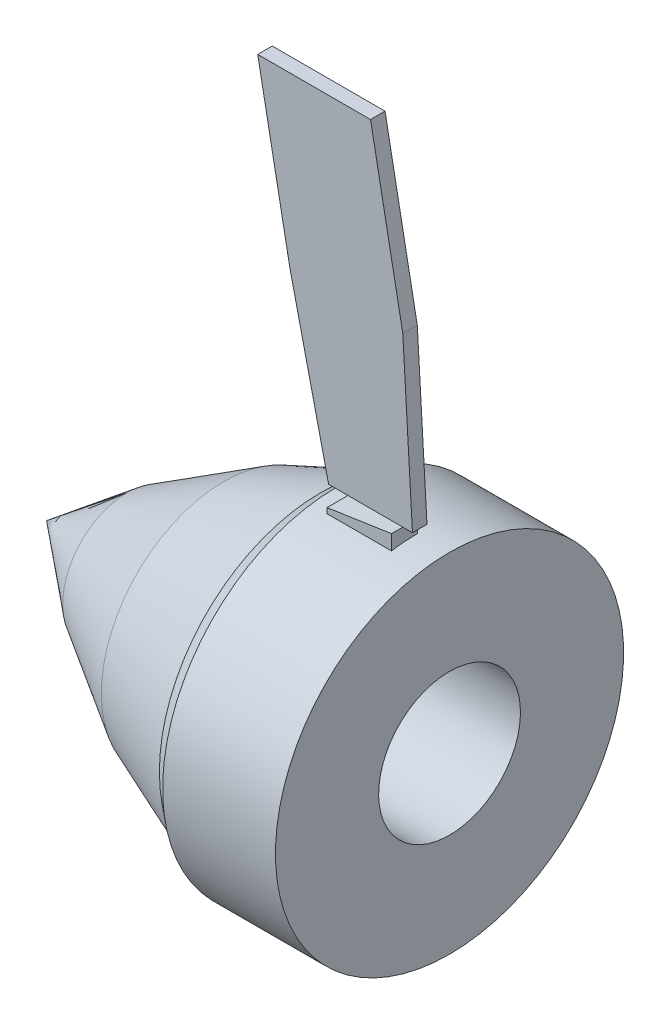
ISO-10303-21;
HEADER;
FILE_DESCRIPTION(('STEP AP214'),'2;1');
FILE_NAME('part.step','',(''),(''),'','','');
FILE_SCHEMA(('AUTOMOTIVE_DESIGN { 1 0 10303 214 1 1 1 1 }'));
ENDSEC;
DATA;
#1=APPLICATION_CONTEXT('core data for automotive mechanical design processes');
#2=APPLICATION_PROTOCOL_DEFINITION('international standard','automotive_design',2000,#1);
#3=PRODUCT_CONTEXT('',#1,'mechanical');
#4=PRODUCT('Part','Part','',(#3));
#5=PRODUCT_RELATED_PRODUCT_CATEGORY('part','',(#4));
#6=PRODUCT_DEFINITION_FORMATION('','',#4);
#7=PRODUCT_DEFINITION_CONTEXT('part definition',#1,'design');
#8=PRODUCT_DEFINITION('design','',#6,#7);
#9=PRODUCT_DEFINITION_SHAPE('','',#8);
#10=(LENGTH_UNIT() NAMED_UNIT(*) SI_UNIT(.MILLI.,.METRE.));
#11=(NAMED_UNIT(*) PLANE_ANGLE_UNIT() SI_UNIT($,.RADIAN.));
#12=(NAMED_UNIT(*) SI_UNIT($,.STERADIAN.) SOLID_ANGLE_UNIT());
#13=UNCERTAINTY_MEASURE_WITH_UNIT(LENGTH_MEASURE(1.E-05),#10,'distance_accuracy_value','');
#14=(GEOMETRIC_REPRESENTATION_CONTEXT(3) GLOBAL_UNCERTAINTY_ASSIGNED_CONTEXT((#13)) GLOBAL_UNIT_ASSIGNED_CONTEXT((#10,
#11,#12)) REPRESENTATION_CONTEXT('',''));
#15=CARTESIAN_POINT('',(0.,0.,0.));
#16=DIRECTION('',(0.,0.,1.));
#17=DIRECTION('',(1.,0.,0.));
#18=AXIS2_PLACEMENT_3D('',#15,#16,#17);
#19=CARTESIAN_POINT('',(1180.,580.,45.));
#20=DIRECTION('',(0.,1.,0.));
#21=DIRECTION('',(0.,0.,1.));
#22=AXIS2_PLACEMENT_3D('',#19,#20,#21);
#23=PLANE('',#22);
#24=DIRECTION('',(1.,0.,0.));
#25=VECTOR('',#24,1.);
#26=CARTESIAN_POINT('',(1180.,580.,0.));
#27=LINE('',#26,#25);
#28=CARTESIAN_POINT('',(920.,580.,0.));
#29=VERTEX_POINT('',#28);
#30=CARTESIAN_POINT('',(1180.,580.,0.));
#31=VERTEX_POINT('',#30);
#32=EDGE_CURVE('E131',#29,#31,#27,.T.);
#33=ORIENTED_EDGE('',*,*,#32,.T.);
#34=DIRECTION('',(0.,0.,-1.));
#35=VECTOR('',#34,1.);
#36=CARTESIAN_POINT('',(1180.,580.,45.));
#37=LINE('',#36,#35);
#38=CARTESIAN_POINT('',(1180.,580.,45.));
#39=VERTEX_POINT('',#38);
#40=EDGE_CURVE('E12',#39,#31,#37,.T.);
#41=ORIENTED_EDGE('',*,*,#40,.F.);
#42=DIRECTION('',(1.,0.,0.));
#43=VECTOR('',#42,1.);
#44=CARTESIAN_POINT('',(1180.,580.,45.));
#45=LINE('',#44,#43);
#46=CARTESIAN_POINT('',(920.,580.,45.));
#47=VERTEX_POINT('',#46);
#48=EDGE_CURVE('E145',#47,#39,#45,.T.);
#49=ORIENTED_EDGE('',*,*,#48,.F.);
#50=DIRECTION('',(0.,0.,-1.));
#51=VECTOR('',#50,1.);
#52=CARTESIAN_POINT('',(920.,580.,45.));
#53=LINE('',#52,#51);
#54=EDGE_CURVE('E128',#47,#29,#53,.T.);
#55=ORIENTED_EDGE('',*,*,#54,.T.);
#56=EDGE_LOOP('',(#33,#41,#49,#55));
#57=FACE_BOUND('',#56,.T.);
#58=ADVANCED_FACE('F49',(#57),#23,.F.);
#59=CARTESIAN_POINT('',(1150.,1100.,45.));
#60=DIRECTION('',(-0.998339941675609,-0.0575965350966698,0.));
#61=DIRECTION('',(0.0575965350966698,-0.998339941675609,0.));
#62=AXIS2_PLACEMENT_3D('',#59,#60,#61);
#63=PLANE('',#62);
#64=DIRECTION('',(-0.0575965350966698,0.998339941675609,0.));
#65=VECTOR('',#64,1.);
#66=CARTESIAN_POINT('',(1150.,1100.,0.));
#67=LINE('',#66,#65);
#68=CARTESIAN_POINT('',(1150.,1100.,0.));
#69=VERTEX_POINT('',#68);
#70=EDGE_CURVE('E140',#31,#69,#67,.T.);
#71=ORIENTED_EDGE('',*,*,#70,.T.);
#72=DIRECTION('',(0.,0.,-1.));
#73=VECTOR('',#72,1.);
#74=CARTESIAN_POINT('',(1150.,1100.,45.));
#75=LINE('',#74,#73);
#76=CARTESIAN_POINT('',(1150.,1100.,45.));
#77=VERTEX_POINT('',#76);
#78=EDGE_CURVE('E59',#77,#69,#75,.T.);
#79=ORIENTED_EDGE('',*,*,#78,.F.);
#80=DIRECTION('',(-0.0575965350966698,0.998339941675609,0.));
#81=VECTOR('',#80,1.);
#82=CARTESIAN_POINT('',(1150.,1100.,45.));
#83=LINE('',#82,#81);
#84=EDGE_CURVE('E103',#39,#77,#83,.T.);
#85=ORIENTED_EDGE('',*,*,#84,.F.);
#86=ORIENTED_EDGE('',*,*,#40,.T.);
#87=EDGE_LOOP('',(#71,#79,#85,#86));
#88=FACE_BOUND('',#87,.T.);
#89=ADVANCED_FACE('F169',(#88),#63,.F.);
#90=CARTESIAN_POINT('',(1050.,1625.,45.));
#91=DIRECTION('',(-0.982338566422475,-0.187112107889995,0.));
#92=DIRECTION('',(0.187112107889995,-0.982338566422475,0.));
#93=AXIS2_PLACEMENT_3D('',#90,#91,#92);
#94=PLANE('',#93);
#95=DIRECTION('',(-0.187112107889995,0.982338566422475,0.));
#96=VECTOR('',#95,1.);
#97=CARTESIAN_POINT('',(1050.,1625.,0.));
#98=LINE('',#97,#96);
#99=CARTESIAN_POINT('',(1050.,1625.,0.));
#100=VERTEX_POINT('',#99);
#101=EDGE_CURVE('E136',#69,#100,#98,.T.);
#102=ORIENTED_EDGE('',*,*,#101,.T.);
#103=DIRECTION('',(0.,0.,-1.));
#104=VECTOR('',#103,1.);
#105=CARTESIAN_POINT('',(1050.,1625.,45.));
#106=LINE('',#105,#104);
#107=CARTESIAN_POINT('',(1050.,1625.,45.));
#108=VERTEX_POINT('',#107);
#109=EDGE_CURVE('E123',#108,#100,#106,.T.);
#110=ORIENTED_EDGE('',*,*,#109,.F.);
#111=DIRECTION('',(-0.187112107889995,0.982338566422475,0.));
#112=VECTOR('',#111,1.);
#113=CARTESIAN_POINT('',(1050.,1625.,45.));
#114=LINE('',#113,#112);
#115=EDGE_CURVE('E117',#77,#108,#114,.T.);
#116=ORIENTED_EDGE('',*,*,#115,.F.);
#117=ORIENTED_EDGE('',*,*,#78,.T.);
#118=EDGE_LOOP('',(#102,#110,#116,#117));
#119=FACE_BOUND('',#118,.T.);
#120=ADVANCED_FACE('F147',(#119),#94,.F.);
#121=CARTESIAN_POINT('',(700.,1625.,45.));
#122=DIRECTION('',(0.,-1.,0.));
#123=DIRECTION('',(0.,0.,-1.));
#124=AXIS2_PLACEMENT_3D('',#121,#122,#123);
#125=PLANE('',#124);
#126=DIRECTION('',(-1.,0.,0.));
#127=VECTOR('',#126,1.);
#128=CARTESIAN_POINT('',(700.,1625.,0.));
#129=LINE('',#128,#127);
#130=CARTESIAN_POINT('',(700.,1625.,0.));
#131=VERTEX_POINT('',#130);
#132=EDGE_CURVE('E121',#100,#131,#129,.T.);
#133=ORIENTED_EDGE('',*,*,#132,.T.);
#134=DIRECTION('',(0.,0.,-1.));
#135=VECTOR('',#134,1.);
#136=CARTESIAN_POINT('',(700.,1625.,45.));
#137=LINE('',#136,#135);
#138=CARTESIAN_POINT('',(700.,1625.,45.));
#139=VERTEX_POINT('',#138);
#140=EDGE_CURVE('E122',#139,#131,#137,.T.);
#141=ORIENTED_EDGE('',*,*,#140,.F.);
#142=DIRECTION('',(-1.,0.,0.));
#143=VECTOR('',#142,1.);
#144=CARTESIAN_POINT('',(700.,1625.,45.));
#145=LINE('',#144,#143);
#146=EDGE_CURVE('E109',#108,#139,#145,.T.);
#147=ORIENTED_EDGE('',*,*,#146,.F.);
#148=ORIENTED_EDGE('',*,*,#109,.T.);
#149=EDGE_LOOP('',(#133,#141,#147,#148));
#150=FACE_BOUND('',#149,.T.);
#151=ADVANCED_FACE('F125',(#150),#125,.F.);
#152=CARTESIAN_POINT('',(800.,1100.,45.));
#153=DIRECTION('',(0.982338566422475,0.187112107889995,0.));
#154=DIRECTION('',(-0.187112107889995,0.982338566422475,0.));
#155=AXIS2_PLACEMENT_3D('',#152,#153,#154);
#156=PLANE('',#155);
#157=DIRECTION('',(0.187112107889995,-0.982338566422475,0.));
#158=VECTOR('',#157,1.);
#159=CARTESIAN_POINT('',(800.,1100.,0.));
#160=LINE('',#159,#158);
#161=CARTESIAN_POINT('',(800.,1100.,0.));
#162=VERTEX_POINT('',#161);
#163=EDGE_CURVE('E90',#131,#162,#160,.T.);
#164=ORIENTED_EDGE('',*,*,#163,.T.);
#165=DIRECTION('',(0.,0.,-1.));
#166=VECTOR('',#165,1.);
#167=CARTESIAN_POINT('',(800.,1100.,45.));
#168=LINE('',#167,#166);
#169=CARTESIAN_POINT('',(800.,1100.,45.));
#170=VERTEX_POINT('',#169);
#171=EDGE_CURVE('E127',#170,#162,#168,.T.);
#172=ORIENTED_EDGE('',*,*,#171,.F.);
#173=DIRECTION('',(0.187112107889995,-0.982338566422475,0.));
#174=VECTOR('',#173,1.);
#175=CARTESIAN_POINT('',(800.,1100.,45.));
#176=LINE('',#175,#174);
#177=EDGE_CURVE('E111',#139,#170,#176,.T.);
#178=ORIENTED_EDGE('',*,*,#177,.F.);
#179=ORIENTED_EDGE('',*,*,#140,.T.);
#180=EDGE_LOOP('',(#164,#172,#178,#179));
#181=FACE_BOUND('',#180,.T.);
#182=ADVANCED_FACE('F126',(#181),#156,.F.);
#183=CARTESIAN_POINT('',(920.,580.,45.));
#184=DIRECTION('',(0.97439119569462,0.224859506698758,0.));
#185=DIRECTION('',(-0.224859506698758,0.97439119569462,0.));
#186=AXIS2_PLACEMENT_3D('',#183,#184,#185);
#187=PLANE('',#186);
#188=DIRECTION('',(0.224859506698758,-0.97439119569462,0.));
#189=VECTOR('',#188,1.);
#190=CARTESIAN_POINT('',(920.,580.,0.));
#191=LINE('',#190,#189);
#192=EDGE_CURVE('E92',#162,#29,#191,.T.);
#193=ORIENTED_EDGE('',*,*,#192,.T.);
#194=ORIENTED_EDGE('',*,*,#54,.F.);
#195=DIRECTION('',(0.224859506698758,-0.97439119569462,0.));
#196=VECTOR('',#195,1.);
#197=CARTESIAN_POINT('',(920.,580.,45.));
#198=LINE('',#197,#196);
#199=EDGE_CURVE('E67',#170,#47,#198,.T.);
#200=ORIENTED_EDGE('',*,*,#199,.F.);
#201=ORIENTED_EDGE('',*,*,#171,.T.);
#202=EDGE_LOOP('',(#193,#194,#200,#201));
#203=FACE_BOUND('',#202,.T.);
#204=ADVANCED_FACE('F160',(#203),#187,.F.);
#205=CARTESIAN_POINT('',(0.,0.,45.));
#206=DIRECTION('',(0.,0.,1.));
#207=DIRECTION('',(1.,0.,0.));
#208=AXIS2_PLACEMENT_3D('',#205,#206,#207);
#209=PLANE('',#208);
#210=ORIENTED_EDGE('',*,*,#48,.T.);
#211=ORIENTED_EDGE('',*,*,#84,.T.);
#212=ORIENTED_EDGE('',*,*,#115,.T.);
#213=ORIENTED_EDGE('',*,*,#146,.T.);
#214=ORIENTED_EDGE('',*,*,#177,.T.);
#215=ORIENTED_EDGE('',*,*,#199,.T.);
#216=EDGE_LOOP('',(#210,#211,#212,#213,#214,#215));
#217=FACE_BOUND('',#216,.T.);
#218=ADVANCED_FACE('F115',(#217),#209,.T.);
#219=CARTESIAN_POINT('',(0.,0.,0.));
#220=DIRECTION('',(0.,0.,1.));
#221=DIRECTION('',(1.,0.,0.));
#222=AXIS2_PLACEMENT_3D('',#219,#220,#221);
#223=PLANE('',#222);
#224=ORIENTED_EDGE('',*,*,#32,.F.);
#225=ORIENTED_EDGE('',*,*,#192,.F.);
#226=ORIENTED_EDGE('',*,*,#163,.F.);
#227=ORIENTED_EDGE('',*,*,#132,.F.);
#228=ORIENTED_EDGE('',*,*,#101,.F.);
#229=ORIENTED_EDGE('',*,*,#70,.F.);
#230=EDGE_LOOP('',(#224,#225,#226,#227,#228,#229));
#231=FACE_BOUND('',#230,.T.);
#232=ADVANCED_FACE('F153',(#231),#223,.F.);
#233=CLOSED_SHELL('',(#58,#89,#120,#151,#182,#204,#218,#232));
#234=MANIFOLD_SOLID_BREP('B2',#233);
#235=CARTESIAN_POINT('',(1150.,500.,80.));
#236=DIRECTION('',(0.,1.,0.));
#237=DIRECTION('',(0.,0.,1.));
#238=AXIS2_PLACEMENT_3D('',#235,#236,#237);
#239=PLANE('',#238);
#240=DIRECTION('',(1.,0.,0.));
#241=VECTOR('',#240,1.);
#242=CARTESIAN_POINT('',(1150.,500.,0.));
#243=LINE('',#242,#241);
#244=CARTESIAN_POINT('',(950.,500.,0.));
#245=VERTEX_POINT('',#244);
#246=CARTESIAN_POINT('',(1150.,500.,0.));
#247=VERTEX_POINT('',#246);
#248=EDGE_CURVE('E296',#245,#247,#243,.T.);
#249=ORIENTED_EDGE('',*,*,#248,.T.);
#250=DIRECTION('',(0.,0.,-1.));
#251=VECTOR('',#250,1.);
#252=CARTESIAN_POINT('',(1150.,500.,80.));
#253=LINE('',#252,#251);
#254=CARTESIAN_POINT('',(1150.,500.,80.));
#255=VERTEX_POINT('',#254);
#256=EDGE_CURVE('E48',#255,#247,#253,.T.);
#257=ORIENTED_EDGE('',*,*,#256,.F.);
#258=DIRECTION('',(1.,0.,0.));
#259=VECTOR('',#258,1.);
#260=CARTESIAN_POINT('',(1150.,500.,80.));
#261=LINE('',#260,#259);
#262=CARTESIAN_POINT('',(950.,500.,80.));
#263=VERTEX_POINT('',#262);
#264=EDGE_CURVE('E290',#263,#255,#261,.T.);
#265=ORIENTED_EDGE('',*,*,#264,.F.);
#266=DIRECTION('',(0.,0.,-1.));
#267=VECTOR('',#266,1.);
#268=CARTESIAN_POINT('',(950.,500.,80.));
#269=LINE('',#268,#267);
#270=EDGE_CURVE('E293',#263,#245,#269,.T.);
#271=ORIENTED_EDGE('',*,*,#270,.T.);
#272=EDGE_LOOP('',(#249,#257,#265,#271));
#273=FACE_BOUND('',#272,.T.);
#274=ADVANCED_FACE('F237',(#273),#239,.F.);
#275=CARTESIAN_POINT('',(1150.,580.,80.));
#276=DIRECTION('',(-1.,0.,0.));
#277=DIRECTION('',(0.,0.,1.));
#278=AXIS2_PLACEMENT_3D('',#275,#276,#277);
#279=PLANE('',#278);
#280=DIRECTION('',(0.,1.,0.));
#281=VECTOR('',#280,1.);
#282=CARTESIAN_POINT('',(1150.,580.,0.));
#283=LINE('',#282,#281);
#284=CARTESIAN_POINT('',(1150.,580.,0.));
#285=VERTEX_POINT('',#284);
#286=EDGE_CURVE('E292',#247,#285,#283,.T.);
#287=ORIENTED_EDGE('',*,*,#286,.T.);
#288=DIRECTION('',(0.,0.,-1.));
#289=VECTOR('',#288,1.);
#290=CARTESIAN_POINT('',(1150.,580.,80.));
#291=LINE('',#290,#289);
#292=CARTESIAN_POINT('',(1150.,580.,80.));
#293=VERTEX_POINT('',#292);
#294=EDGE_CURVE('E241',#293,#285,#291,.T.);
#295=ORIENTED_EDGE('',*,*,#294,.F.);
#296=DIRECTION('',(0.,1.,0.));
#297=VECTOR('',#296,1.);
#298=CARTESIAN_POINT('',(1150.,580.,80.));
#299=LINE('',#298,#297);
#300=EDGE_CURVE('E285',#255,#293,#299,.T.);
#301=ORIENTED_EDGE('',*,*,#300,.F.);
#302=ORIENTED_EDGE('',*,*,#256,.T.);
#303=EDGE_LOOP('',(#287,#295,#301,#302));
#304=FACE_BOUND('',#303,.T.);
#305=ADVANCED_FACE('F288',(#304),#279,.F.);
#306=CARTESIAN_POINT('',(950.,550.,80.));
#307=DIRECTION('',(0.148340452930244,-0.988936352868298,0.));
#308=DIRECTION('',(0.988936352868298,0.148340452930244,0.));
#309=AXIS2_PLACEMENT_3D('',#306,#307,#308);
#310=PLANE('',#309);
#311=DIRECTION('',(-0.988936352868298,-0.148340452930244,0.));
#312=VECTOR('',#311,1.);
#313=CARTESIAN_POINT('',(950.,550.,0.));
#314=LINE('',#313,#312);
#315=CARTESIAN_POINT('',(950.,550.,0.));
#316=VERTEX_POINT('',#315);
#317=EDGE_CURVE('E267',#285,#316,#314,.T.);
#318=ORIENTED_EDGE('',*,*,#317,.T.);
#319=DIRECTION('',(0.,0.,-1.));
#320=VECTOR('',#319,1.);
#321=CARTESIAN_POINT('',(950.,550.,80.));
#322=LINE('',#321,#320);
#323=CARTESIAN_POINT('',(950.,550.,80.));
#324=VERTEX_POINT('',#323);
#325=EDGE_CURVE('E295',#324,#316,#322,.T.);
#326=ORIENTED_EDGE('',*,*,#325,.F.);
#327=DIRECTION('',(-0.988936352868298,-0.148340452930244,0.));
#328=VECTOR('',#327,1.);
#329=CARTESIAN_POINT('',(950.,550.,80.));
#330=LINE('',#329,#328);
#331=EDGE_CURVE('E283',#293,#324,#330,.T.);
#332=ORIENTED_EDGE('',*,*,#331,.F.);
#333=ORIENTED_EDGE('',*,*,#294,.T.);
#334=EDGE_LOOP('',(#318,#326,#332,#333));
#335=FACE_BOUND('',#334,.T.);
#336=ADVANCED_FACE('F291',(#335),#310,.F.);
#337=CARTESIAN_POINT('',(950.,500.,80.));
#338=DIRECTION('',(1.,0.,0.));
#339=DIRECTION('',(0.,0.,-1.));
#340=AXIS2_PLACEMENT_3D('',#337,#338,#339);
#341=PLANE('',#340);
#342=DIRECTION('',(0.,-1.,0.));
#343=VECTOR('',#342,1.);
#344=CARTESIAN_POINT('',(950.,500.,0.));
#345=LINE('',#344,#343);
#346=EDGE_CURVE('E274',#316,#245,#345,.T.);
#347=ORIENTED_EDGE('',*,*,#346,.T.);
#348=ORIENTED_EDGE('',*,*,#270,.F.);
#349=DIRECTION('',(0.,-1.,0.));
#350=VECTOR('',#349,1.);
#351=CARTESIAN_POINT('',(950.,500.,80.));
#352=LINE('',#351,#350);
#353=EDGE_CURVE('E252',#324,#263,#352,.T.);
#354=ORIENTED_EDGE('',*,*,#353,.F.);
#355=ORIENTED_EDGE('',*,*,#325,.T.);
#356=EDGE_LOOP('',(#347,#348,#354,#355));
#357=FACE_BOUND('',#356,.T.);
#358=ADVANCED_FACE('F308',(#357),#341,.F.);
#359=CARTESIAN_POINT('',(0.,0.,80.));
#360=DIRECTION('',(0.,0.,-1.));
#361=DIRECTION('',(-1.,0.,0.));
#362=AXIS2_PLACEMENT_3D('',#359,#360,#361);
#363=PLANE('',#362);
#364=ORIENTED_EDGE('',*,*,#264,.T.);
#365=ORIENTED_EDGE('',*,*,#300,.T.);
#366=ORIENTED_EDGE('',*,*,#331,.T.);
#367=ORIENTED_EDGE('',*,*,#353,.T.);
#368=EDGE_LOOP('',(#364,#365,#366,#367));
#369=FACE_BOUND('',#368,.T.);
#370=ADVANCED_FACE('F284',(#369),#363,.F.);
#371=CARTESIAN_POINT('',(0.,0.,0.));
#372=DIRECTION('',(0.,0.,-1.));
#373=DIRECTION('',(-1.,0.,0.));
#374=AXIS2_PLACEMENT_3D('',#371,#372,#373);
#375=PLANE('',#374);
#376=ORIENTED_EDGE('',*,*,#248,.F.);
#377=ORIENTED_EDGE('',*,*,#346,.F.);
#378=ORIENTED_EDGE('',*,*,#317,.F.);
#379=ORIENTED_EDGE('',*,*,#286,.F.);
#380=EDGE_LOOP('',(#376,#377,#378,#379));
#381=FACE_BOUND('',#380,.T.);
#382=ADVANCED_FACE('F310',(#381),#375,.T.);
#383=CLOSED_SHELL('',(#274,#305,#336,#358,#370,#382));
#384=MANIFOLD_SOLID_BREP('B6',#383);
#385=CARTESIAN_POINT('',(0.,0.,0.));
#386=DIRECTION('',(-1.,0.,0.));
#387=DIRECTION('',(0.,0.,1.));
#388=AXIS2_PLACEMENT_3D('',#385,#386,#387);
#389=CYLINDRICAL_SURFACE('',#388,220.);
#390=CARTESIAN_POINT('',(900.,0.,0.));
#391=DIRECTION('',(-1.,0.,0.));
#392=DIRECTION('',(0.,0.,1.));
#393=AXIS2_PLACEMENT_3D('',#390,#391,#392);
#394=CIRCLE('',#393,220.);
#395=CARTESIAN_POINT('',(900.,220.,-1.57950893313031E-06));
#396=VERTEX_POINT('',#395);
#397=CARTESIAN_POINT('',(900.,220.,0.));
#398=VERTEX_POINT('',#397);
#399=EDGE_CURVE('E231',#396,#398,#394,.T.);
#400=ORIENTED_EDGE('',*,*,#399,.T.);
#401=DIRECTION('',(1.,0.,0.));
#402=VECTOR('',#401,1.);
#403=CARTESIAN_POINT('',(1250.,220.,0.));
#404=LINE('',#403,#402);
#405=CARTESIAN_POINT('',(1250.,220.,0.));
#406=VERTEX_POINT('',#405);
#407=EDGE_CURVE('E430',#398,#406,#404,.T.);
#408=ORIENTED_EDGE('',*,*,#407,.T.);
#409=CARTESIAN_POINT('',(1250.,0.,0.));
#410=DIRECTION('',(-1.,0.,0.));
#411=DIRECTION('',(0.,0.,1.));
#412=AXIS2_PLACEMENT_3D('',#409,#410,#411);
#413=CIRCLE('',#412,220.);
#414=CARTESIAN_POINT('',(1250.,220.,-1.57950893313031E-06));
#415=VERTEX_POINT('',#414);
#416=EDGE_CURVE('E406',#415,#406,#413,.T.);
#417=ORIENTED_EDGE('',*,*,#416,.F.);
#418=DIRECTION('',(1.,0.,0.));
#419=VECTOR('',#418,1.);
#420=CARTESIAN_POINT('',(1250.,220.,-1.57950893313031E-06));
#421=LINE('',#420,#419);
#422=EDGE_CURVE('E434',#396,#415,#421,.T.);
#423=ORIENTED_EDGE('',*,*,#422,.F.);
#424=EDGE_LOOP('',(#400,#408,#417,#423));
#425=FACE_BOUND('',#424,.T.);
#426=ADVANCED_FACE('F369',(#425),#389,.F.);
#427=CARTESIAN_POINT('',(900.,220.,-1.57950893313031E-06));
#428=DIRECTION('',(1.,0.,0.));
#429=DIRECTION('',(0.,0.,-1.));
#430=AXIS2_PLACEMENT_3D('',#427,#428,#429);
#431=PLANE('',#430);
#432=CARTESIAN_POINT('',(900.,0.,0.));
#433=DIRECTION('',(-1.,0.,0.));
#434=DIRECTION('',(0.,0.,1.));
#435=AXIS2_PLACEMENT_3D('',#432,#433,#434);
#436=CIRCLE('',#435,540.);
#437=CARTESIAN_POINT('',(900.,540.,-3.87697647222894E-06));
#438=VERTEX_POINT('',#437);
#439=CARTESIAN_POINT('',(900.,540.,0.));
#440=VERTEX_POINT('',#439);
#441=EDGE_CURVE('E380',#438,#440,#436,.T.);
#442=ORIENTED_EDGE('',*,*,#441,.T.);
#443=DIRECTION('',(0.,-1.,0.));
#444=VECTOR('',#443,1.);
#445=CARTESIAN_POINT('',(900.,220.,0.));
#446=LINE('',#445,#444);
#447=EDGE_CURVE('E433',#440,#398,#446,.T.);
#448=ORIENTED_EDGE('',*,*,#447,.T.);
#449=ORIENTED_EDGE('',*,*,#399,.F.);
#450=DIRECTION('',(0.,-1.,7.17958605968322E-09));
#451=VECTOR('',#450,1.);
#452=CARTESIAN_POINT('',(900.,220.,-1.57950893313031E-06));
#453=LINE('',#452,#451);
#454=EDGE_CURVE('E423',#438,#396,#453,.T.);
#455=ORIENTED_EDGE('',*,*,#454,.F.);
#456=EDGE_LOOP('',(#442,#448,#449,#455));
#457=FACE_BOUND('',#456,.T.);
#458=ADVANCED_FACE('F371',(#457),#431,.F.);
#459=CARTESIAN_POINT('',(0.,0.,0.));
#460=DIRECTION('',(-1.,0.,0.));
#461=DIRECTION('',(0.,0.,1.));
#462=AXIS2_PLACEMENT_3D('',#459,#460,#461);
#463=CYLINDRICAL_SURFACE('',#462,540.);
#464=CARTESIAN_POINT('',(1250.,0.,0.));
#465=DIRECTION('',(-1.,0.,0.));
#466=DIRECTION('',(0.,0.,1.));
#467=AXIS2_PLACEMENT_3D('',#464,#465,#466);
#468=CIRCLE('',#467,540.);
#469=CARTESIAN_POINT('',(1250.,540.,-3.87697647222894E-06));
#470=VERTEX_POINT('',#469);
#471=CARTESIAN_POINT('',(1250.,540.,0.));
#472=VERTEX_POINT('',#471);
#473=EDGE_CURVE('E419',#470,#472,#468,.T.);
#474=ORIENTED_EDGE('',*,*,#473,.T.);
#475=DIRECTION('',(-1.,0.,0.));
#476=VECTOR('',#475,1.);
#477=CARTESIAN_POINT('',(900.,540.,0.));
#478=LINE('',#477,#476);
#479=EDGE_CURVE('E428',#472,#440,#478,.T.);
#480=ORIENTED_EDGE('',*,*,#479,.T.);
#481=ORIENTED_EDGE('',*,*,#441,.F.);
#482=DIRECTION('',(-1.,0.,0.));
#483=VECTOR('',#482,1.);
#484=CARTESIAN_POINT('',(900.,540.,-3.87697647222894E-06));
#485=LINE('',#484,#483);
#486=EDGE_CURVE('E437',#470,#438,#485,.T.);
#487=ORIENTED_EDGE('',*,*,#486,.F.);
#488=EDGE_LOOP('',(#474,#480,#481,#487));
#489=FACE_BOUND('',#488,.T.);
#490=ADVANCED_FACE('F442',(#489),#463,.T.);
#491=CARTESIAN_POINT('',(1250.,540.,-3.87697647222894E-06));
#492=DIRECTION('',(-1.,0.,0.));
#493=DIRECTION('',(0.,0.,1.));
#494=AXIS2_PLACEMENT_3D('',#491,#492,#493);
#495=PLANE('',#494);
#496=DIRECTION('',(0.,1.,-7.17958605968322E-09));
#497=VECTOR('',#496,1.);
#498=CARTESIAN_POINT('',(1250.,540.,-3.87697647222894E-06));
#499=LINE('',#498,#497);
#500=EDGE_CURVE('E413',#415,#470,#499,.T.);
#501=ORIENTED_EDGE('',*,*,#500,.F.);
#502=ORIENTED_EDGE('',*,*,#416,.T.);
#503=DIRECTION('',(0.,1.,0.));
#504=VECTOR('',#503,1.);
#505=CARTESIAN_POINT('',(1250.,540.,0.));
#506=LINE('',#505,#504);
#507=EDGE_CURVE('E415',#406,#472,#506,.T.);
#508=ORIENTED_EDGE('',*,*,#507,.T.);
#509=ORIENTED_EDGE('',*,*,#473,.F.);
#510=EDGE_LOOP('',(#501,#502,#508,#509));
#511=FACE_BOUND('',#510,.T.);
#512=ADVANCED_FACE('F412',(#511),#495,.F.);
#513=CARTESIAN_POINT('',(0.,0.,0.));
#514=DIRECTION('',(0.,-7.17958605968322E-09,-1.));
#515=DIRECTION('',(-1.,0.,0.));
#516=AXIS2_PLACEMENT_3D('',#513,#514,#515);
#517=PLANE('',#516);
#518=ORIENTED_EDGE('',*,*,#422,.T.);
#519=ORIENTED_EDGE('',*,*,#500,.T.);
#520=ORIENTED_EDGE('',*,*,#486,.T.);
#521=ORIENTED_EDGE('',*,*,#454,.T.);
#522=EDGE_LOOP('',(#518,#519,#520,#521));
#523=FACE_BOUND('',#522,.T.);
#524=ADVANCED_FACE('F444',(#523),#517,.F.);
#525=CARTESIAN_POINT('',(0.,0.,0.));
#526=DIRECTION('',(0.,0.,-1.));
#527=DIRECTION('',(-1.,0.,0.));
#528=AXIS2_PLACEMENT_3D('',#525,#526,#527);
#529=PLANE('',#528);
#530=ORIENTED_EDGE('',*,*,#407,.F.);
#531=ORIENTED_EDGE('',*,*,#447,.F.);
#532=ORIENTED_EDGE('',*,*,#479,.F.);
#533=ORIENTED_EDGE('',*,*,#507,.F.);
#534=EDGE_LOOP('',(#530,#531,#532,#533));
#535=FACE_BOUND('',#534,.T.);
#536=ADVANCED_FACE('F422',(#535),#529,.T.);
#537=CLOSED_SHELL('',(#426,#458,#490,#512,#524,#536));
#538=MANIFOLD_SOLID_BREP('B45',#537);
#539=CARTESIAN_POINT('',(50.,0.,0.));
#540=DIRECTION('',(1.,0.,0.));
#541=DIRECTION('',(0.,0.,-1.));
#542=AXIS2_PLACEMENT_3D('',#539,#540,#541);
#543=CONICAL_SURFACE('',#542,0.,0.704494064242218);
#544=CARTESIAN_POINT('',(250.,0.,0.));
#545=DIRECTION('',(-1.,0.,0.));
#546=DIRECTION('',(0.,0.,1.));
#547=AXIS2_PLACEMENT_3D('',#544,#545,#546);
#548=CIRCLE('',#547,170.);
#549=CARTESIAN_POINT('',(250.,170.,-1.22052963014615E-06));
#550=VERTEX_POINT('',#549);
#551=CARTESIAN_POINT('',(250.,170.,0.));
#552=VERTEX_POINT('',#551);
#553=EDGE_CURVE('E370',#550,#552,#548,.T.);
#554=ORIENTED_EDGE('',*,*,#553,.F.);
#555=DIRECTION('',(0.761939317759459,0.64764842009554,-4.64984756849381E-09));
#556=VECTOR('',#555,1.);
#557=CARTESIAN_POINT('',(250.,170.,-1.22052963014615E-06));
#558=LINE('',#557,#556);
#559=CARTESIAN_POINT('',(50.,0.,0.));
#560=VERTEX_POINT('',#559);
#561=EDGE_CURVE('E572',#560,#550,#558,.T.);
#562=ORIENTED_EDGE('',*,*,#561,.F.);
#563=DIRECTION('',(0.761939317759459,0.64764842009554,0.));
#564=VECTOR('',#563,1.);
#565=CARTESIAN_POINT('',(250.,170.,0.));
#566=LINE('',#565,#564);
#567=EDGE_CURVE('E568',#560,#552,#566,.T.);
#568=ORIENTED_EDGE('',*,*,#567,.T.);
#569=EDGE_LOOP('',(#554,#562,#568));
#570=FACE_BOUND('',#569,.T.);
#571=ADVANCED_FACE('F483',(#570),#543,.F.);
#572=CARTESIAN_POINT('',(250.,0.,0.));
#573=DIRECTION('',(1.,0.,0.));
#574=DIRECTION('',(0.,0.,-1.));
#575=AXIS2_PLACEMENT_3D('',#572,#573,#574);
#576=CONICAL_SURFACE('',#575,170.,0.540419500270584);
#577=CARTESIAN_POINT('',(550.,0.,0.));
#578=DIRECTION('',(-1.,0.,0.));
#579=DIRECTION('',(0.,0.,1.));
#580=AXIS2_PLACEMENT_3D('',#577,#578,#579);
#581=CIRCLE('',#580,350.);
#582=CARTESIAN_POINT('',(550.,350.,-2.51285512088913E-06));
#583=VERTEX_POINT('',#582);
#584=CARTESIAN_POINT('',(550.,350.,0.));
#585=VERTEX_POINT('',#584);
#586=EDGE_CURVE('E489',#583,#585,#581,.T.);
#587=ORIENTED_EDGE('',*,*,#586,.F.);
#588=DIRECTION('',(0.857492925712544,0.514495755427526,-3.69386655343366E-09));
#589=VECTOR('',#588,1.);
#590=CARTESIAN_POINT('',(550.,350.,-2.51285512088913E-06));
#591=LINE('',#590,#589);
#592=EDGE_CURVE('E567',#550,#583,#591,.T.);
#593=ORIENTED_EDGE('',*,*,#592,.F.);
#594=ORIENTED_EDGE('',*,*,#553,.T.);
#595=DIRECTION('',(0.857492925712544,0.514495755427526,0.));
#596=VECTOR('',#595,1.);
#597=CARTESIAN_POINT('',(550.,350.,0.));
#598=LINE('',#597,#596);
#599=EDGE_CURVE('E564',#552,#585,#598,.T.);
#600=ORIENTED_EDGE('',*,*,#599,.T.);
#601=EDGE_LOOP('',(#587,#593,#594,#600));
#602=FACE_BOUND('',#601,.T.);
#603=ADVANCED_FACE('F562',(#602),#576,.F.);
#604=CARTESIAN_POINT('',(550.,0.,0.));
#605=DIRECTION('',(1.,0.,0.));
#606=DIRECTION('',(0.,0.,-1.));
#607=AXIS2_PLACEMENT_3D('',#604,#605,#606);
#608=CONICAL_SURFACE('',#607,350.,0.351444794003552);
#609=CARTESIAN_POINT('',(850.,0.,0.));
#610=DIRECTION('',(-1.,0.,0.));
#611=DIRECTION('',(0.,0.,1.));
#612=AXIS2_PLACEMENT_3D('',#609,#610,#611);
#613=CIRCLE('',#612,460.);
#614=CARTESIAN_POINT('',(850.,460.,-3.30260958745428E-06));
#615=VERTEX_POINT('',#614);
#616=CARTESIAN_POINT('',(850.,460.,0.));
#617=VERTEX_POINT('',#616);
#618=EDGE_CURVE('E636',#615,#617,#613,.T.);
#619=ORIENTED_EDGE('',*,*,#618,.F.);
#620=DIRECTION('',(0.938876315886608,0.344254649158423,-2.47160588007895E-09));
#621=VECTOR('',#620,1.);
#622=CARTESIAN_POINT('',(850.,460.,-3.30260958745428E-06));
#623=LINE('',#622,#621);
#624=EDGE_CURVE('E603',#583,#615,#623,.T.);
#625=ORIENTED_EDGE('',*,*,#624,.F.);
#626=ORIENTED_EDGE('',*,*,#586,.T.);
#627=DIRECTION('',(0.938876315886608,0.344254649158423,0.));
#628=VECTOR('',#627,1.);
#629=CARTESIAN_POINT('',(850.,460.,0.));
#630=LINE('',#629,#628);
#631=EDGE_CURVE('E579',#585,#617,#630,.T.);
#632=ORIENTED_EDGE('',*,*,#631,.T.);
#633=EDGE_LOOP('',(#619,#625,#626,#632));
#634=FACE_BOUND('',#633,.T.);
#635=ADVANCED_FACE('F643',(#634),#608,.F.);
#636=CARTESIAN_POINT('',(0.,0.,0.));
#637=DIRECTION('',(-1.,0.,0.));
#638=DIRECTION('',(0.,0.,1.));
#639=AXIS2_PLACEMENT_3D('',#636,#637,#638);
#640=CYLINDRICAL_SURFACE('',#639,460.);
#641=CARTESIAN_POINT('',(920.,0.,0.));
#642=DIRECTION('',(-1.,0.,0.));
#643=DIRECTION('',(0.,0.,1.));
#644=AXIS2_PLACEMENT_3D('',#641,#642,#643);
#645=CIRCLE('',#644,460.);
#646=CARTESIAN_POINT('',(920.,460.,-3.30260958745428E-06));
#647=VERTEX_POINT('',#646);
#648=CARTESIAN_POINT('',(920.,460.,0.));
#649=VERTEX_POINT('',#648);
#650=EDGE_CURVE('E638',#647,#649,#645,.T.);
#651=ORIENTED_EDGE('',*,*,#650,.F.);
#652=DIRECTION('',(1.,0.,0.));
#653=VECTOR('',#652,1.);
#654=CARTESIAN_POINT('',(920.,460.,-3.30260958745428E-06));
#655=LINE('',#654,#653);
#656=EDGE_CURVE('E610',#615,#647,#655,.T.);
#657=ORIENTED_EDGE('',*,*,#656,.F.);
#658=ORIENTED_EDGE('',*,*,#618,.T.);
#659=DIRECTION('',(1.,0.,0.));
#660=VECTOR('',#659,1.);
#661=CARTESIAN_POINT('',(920.,460.,0.));
#662=LINE('',#661,#660);
#663=EDGE_CURVE('E578',#617,#649,#662,.T.);
#664=ORIENTED_EDGE('',*,*,#663,.T.);
#665=EDGE_LOOP('',(#651,#657,#658,#664));
#666=FACE_BOUND('',#665,.T.);
#667=ADVANCED_FACE('F661',(#666),#640,.F.);
#668=CARTESIAN_POINT('',(920.,540.,-3.87697647222894E-06));
#669=DIRECTION('',(-1.,0.,0.));
#670=DIRECTION('',(0.,0.,1.));
#671=AXIS2_PLACEMENT_3D('',#668,#669,#670);
#672=PLANE('',#671);
#673=CARTESIAN_POINT('',(920.,0.,0.));
#674=DIRECTION('',(-1.,0.,0.));
#675=DIRECTION('',(0.,0.,1.));
#676=AXIS2_PLACEMENT_3D('',#673,#674,#675);
#677=CIRCLE('',#676,540.);
#678=CARTESIAN_POINT('',(920.,540.,-3.87697647222894E-06));
#679=VERTEX_POINT('',#678);
#680=CARTESIAN_POINT('',(920.,540.,0.));
#681=VERTEX_POINT('',#680);
#682=EDGE_CURVE('E631',#679,#681,#677,.T.);
#683=ORIENTED_EDGE('',*,*,#682,.F.);
#684=DIRECTION('',(0.,1.,-7.17958605968322E-09));
#685=VECTOR('',#684,1.);
#686=CARTESIAN_POINT('',(920.,540.,-3.87697647222894E-06));
#687=LINE('',#686,#685);
#688=EDGE_CURVE('E608',#647,#679,#687,.T.);
#689=ORIENTED_EDGE('',*,*,#688,.F.);
#690=ORIENTED_EDGE('',*,*,#650,.T.);
#691=DIRECTION('',(0.,1.,0.));
#692=VECTOR('',#691,1.);
#693=CARTESIAN_POINT('',(920.,540.,0.));
#694=LINE('',#693,#692);
#695=EDGE_CURVE('E584',#649,#681,#694,.T.);
#696=ORIENTED_EDGE('',*,*,#695,.T.);
#697=EDGE_LOOP('',(#683,#689,#690,#696));
#698=FACE_BOUND('',#697,.T.);
#699=ADVANCED_FACE('F665',(#698),#672,.F.);
#700=CARTESIAN_POINT('',(0.,0.,0.));
#701=DIRECTION('',(-1.,0.,0.));
#702=DIRECTION('',(0.,0.,1.));
#703=AXIS2_PLACEMENT_3D('',#700,#701,#702);
#704=CYLINDRICAL_SURFACE('',#703,540.);
#705=CARTESIAN_POINT('',(900.,0.,0.));
#706=DIRECTION('',(-1.,0.,0.));
#707=DIRECTION('',(0.,0.,1.));
#708=AXIS2_PLACEMENT_3D('',#705,#706,#707);
#709=CIRCLE('',#708,540.);
#710=CARTESIAN_POINT('',(900.,540.,-3.87697647222894E-06));
#711=VERTEX_POINT('',#710);
#712=CARTESIAN_POINT('',(900.,540.,0.));
#713=VERTEX_POINT('',#712);
#714=EDGE_CURVE('E635',#711,#713,#709,.T.);
#715=ORIENTED_EDGE('',*,*,#714,.F.);
#716=DIRECTION('',(-1.,0.,0.));
#717=VECTOR('',#716,1.);
#718=CARTESIAN_POINT('',(900.,540.,-3.87697647222894E-06));
#719=LINE('',#718,#717);
#720=EDGE_CURVE('E614',#679,#711,#719,.T.);
#721=ORIENTED_EDGE('',*,*,#720,.F.);
#722=ORIENTED_EDGE('',*,*,#682,.T.);
#723=DIRECTION('',(-1.,0.,0.));
#724=VECTOR('',#723,1.);
#725=CARTESIAN_POINT('',(900.,540.,0.));
#726=LINE('',#725,#724);
#727=EDGE_CURVE('E586',#681,#713,#726,.T.);
#728=ORIENTED_EDGE('',*,*,#727,.T.);
#729=EDGE_LOOP('',(#715,#721,#722,#728));
#730=FACE_BOUND('',#729,.T.);
#731=ADVANCED_FACE('F657',(#730),#704,.T.);
#732=CARTESIAN_POINT('',(900.,0.,0.));
#733=DIRECTION('',(1.,0.,0.));
#734=DIRECTION('',(0.,0.,-1.));
#735=AXIS2_PLACEMENT_3D('',#732,#733,#734);
#736=CONICAL_SURFACE('',#735,540.,0.674740942223553);
#737=CARTESIAN_POINT('',(850.,0.,0.));
#738=DIRECTION('',(-1.,0.,0.));
#739=DIRECTION('',(0.,0.,1.));
#740=AXIS2_PLACEMENT_3D('',#737,#738,#739);
#741=CIRCLE('',#740,500.);
#742=CARTESIAN_POINT('',(850.,500.,-3.58979302984161E-06));
#743=VERTEX_POINT('',#742);
#744=CARTESIAN_POINT('',(850.,500.,0.));
#745=VERTEX_POINT('',#744);
#746=EDGE_CURVE('E628',#743,#745,#741,.T.);
#747=ORIENTED_EDGE('',*,*,#746,.F.);
#748=DIRECTION('',(-0.78086880944303,-0.624695047554424,4.48505185497489E-09));
#749=VECTOR('',#748,1.);
#750=CARTESIAN_POINT('',(850.,500.,-3.58979302984161E-06));
#751=LINE('',#750,#749);
#752=EDGE_CURVE('E617',#711,#743,#751,.T.);
#753=ORIENTED_EDGE('',*,*,#752,.F.);
#754=ORIENTED_EDGE('',*,*,#714,.T.);
#755=DIRECTION('',(-0.78086880944303,-0.624695047554424,0.));
#756=VECTOR('',#755,1.);
#757=CARTESIAN_POINT('',(850.,500.,0.));
#758=LINE('',#757,#756);
#759=EDGE_CURVE('E591',#713,#745,#758,.T.);
#760=ORIENTED_EDGE('',*,*,#759,.T.);
#761=EDGE_LOOP('',(#747,#753,#754,#760));
#762=FACE_BOUND('',#761,.T.);
#763=ADVANCED_FACE('F652',(#762),#736,.T.);
#764=CARTESIAN_POINT('',(850.,0.,0.));
#765=DIRECTION('',(1.,0.,0.));
#766=DIRECTION('',(0.,0.,-1.));
#767=AXIS2_PLACEMENT_3D('',#764,#765,#766);
#768=CONICAL_SURFACE('',#767,500.,0.380506377112365);
#769=CARTESIAN_POINT('',(550.,0.,0.));
#770=DIRECTION('',(-1.,0.,0.));
#771=DIRECTION('',(0.,0.,1.));
#772=AXIS2_PLACEMENT_3D('',#769,#770,#771);
#773=CIRCLE('',#772,380.);
#774=CARTESIAN_POINT('',(550.,380.,-2.72824270267963E-06));
#775=VERTEX_POINT('',#774);
#776=CARTESIAN_POINT('',(550.,380.,0.));
#777=VERTEX_POINT('',#776);
#778=EDGE_CURVE('E629',#775,#777,#773,.T.);
#779=ORIENTED_EDGE('',*,*,#778,.F.);
#780=DIRECTION('',(-0.928476690885259,-0.371390676354104,2.66643132264825E-09));
#781=VECTOR('',#780,1.);
#782=CARTESIAN_POINT('',(550.,380.,-2.72824270267963E-06));
#783=LINE('',#782,#781);
#784=EDGE_CURVE('E616',#743,#775,#783,.T.);
#785=ORIENTED_EDGE('',*,*,#784,.F.);
#786=ORIENTED_EDGE('',*,*,#746,.T.);
#787=DIRECTION('',(-0.928476690885259,-0.371390676354104,0.));
#788=VECTOR('',#787,1.);
#789=CARTESIAN_POINT('',(550.,380.,0.));
#790=LINE('',#789,#788);
#791=EDGE_CURVE('E592',#745,#777,#790,.T.);
#792=ORIENTED_EDGE('',*,*,#791,.T.);
#793=EDGE_LOOP('',(#779,#785,#786,#792));
#794=FACE_BOUND('',#793,.T.);
#795=ADVANCED_FACE('F651',(#794),#768,.T.);
#796=CARTESIAN_POINT('',(550.,0.,0.));
#797=DIRECTION('',(1.,0.,0.));
#798=DIRECTION('',(0.,0.,-1.));
#799=AXIS2_PLACEMENT_3D('',#796,#797,#798);
#800=CONICAL_SURFACE('',#799,380.,0.540419500270584);
#801=CARTESIAN_POINT('',(250.,0.,0.));
#802=DIRECTION('',(-1.,0.,0.));
#803=DIRECTION('',(0.,0.,1.));
#804=AXIS2_PLACEMENT_3D('',#801,#802,#803);
#805=CIRCLE('',#804,200.);
#806=CARTESIAN_POINT('',(250.,200.,-1.43591721193664E-06));
#807=VERTEX_POINT('',#806);
#808=CARTESIAN_POINT('',(250.,200.,0.));
#809=VERTEX_POINT('',#808);
#810=EDGE_CURVE('E501',#807,#809,#805,.T.);
#811=ORIENTED_EDGE('',*,*,#810,.F.);
#812=DIRECTION('',(-0.857492925712544,-0.514495755427526,3.69386655343366E-09));
#813=VECTOR('',#812,1.);
#814=CARTESIAN_POINT('',(250.,200.,-1.43591721193664E-06));
#815=LINE('',#814,#813);
#816=EDGE_CURVE('E625',#775,#807,#815,.T.);
#817=ORIENTED_EDGE('',*,*,#816,.F.);
#818=ORIENTED_EDGE('',*,*,#778,.T.);
#819=DIRECTION('',(-0.857492925712544,-0.514495755427526,0.));
#820=VECTOR('',#819,1.);
#821=CARTESIAN_POINT('',(250.,200.,0.));
#822=LINE('',#821,#820);
#823=EDGE_CURVE('E600',#777,#809,#822,.T.);
#824=ORIENTED_EDGE('',*,*,#823,.T.);
#825=EDGE_LOOP('',(#811,#817,#818,#824));
#826=FACE_BOUND('',#825,.T.);
#827=ADVANCED_FACE('F648',(#826),#800,.T.);
#828=CARTESIAN_POINT('',(250.,0.,0.));
#829=DIRECTION('',(1.,0.,0.));
#830=DIRECTION('',(0.,0.,-1.));
#831=AXIS2_PLACEMENT_3D('',#828,#829,#830);
#832=CONICAL_SURFACE('',#831,200.,0.674740942223553);
#833=DIRECTION('',(-0.78086880944303,-0.624695047554424,4.48505185497489E-09));
#834=VECTOR('',#833,1.);
#835=CARTESIAN_POINT('',(0.,0.,0.));
#836=LINE('',#835,#834);
#837=CARTESIAN_POINT('',(0.,0.,0.));
#838=VERTEX_POINT('',#837);
#839=EDGE_CURVE('E624',#807,#838,#836,.T.);
#840=ORIENTED_EDGE('',*,*,#839,.F.);
#841=ORIENTED_EDGE('',*,*,#810,.T.);
#842=DIRECTION('',(-0.78086880944303,-0.624695047554424,0.));
#843=VECTOR('',#842,1.);
#844=CARTESIAN_POINT('',(0.,0.,0.));
#845=LINE('',#844,#843);
#846=EDGE_CURVE('E500',#809,#838,#845,.T.);
#847=ORIENTED_EDGE('',*,*,#846,.T.);
#848=EDGE_LOOP('',(#840,#841,#847));
#849=FACE_BOUND('',#848,.T.);
#850=ADVANCED_FACE('F663',(#849),#832,.T.);
#851=CARTESIAN_POINT('',(0.,0.,0.));
#852=DIRECTION('',(0.,7.17958605968322E-09,1.));
#853=DIRECTION('',(1.,0.,0.));
#854=AXIS2_PLACEMENT_3D('',#851,#852,#853);
#855=PLANE('',#854);
#856=DIRECTION('',(1.,0.,0.));
#857=VECTOR('',#856,1.);
#858=CARTESIAN_POINT('',(50.,0.,0.));
#859=LINE('',#858,#857);
#860=EDGE_CURVE('E599',#838,#560,#859,.T.);
#861=ORIENTED_EDGE('',*,*,#860,.T.);
#862=ORIENTED_EDGE('',*,*,#561,.T.);
#863=ORIENTED_EDGE('',*,*,#592,.T.);
#864=ORIENTED_EDGE('',*,*,#624,.T.);
#865=ORIENTED_EDGE('',*,*,#656,.T.);
#866=ORIENTED_EDGE('',*,*,#688,.T.);
#867=ORIENTED_EDGE('',*,*,#720,.T.);
#868=ORIENTED_EDGE('',*,*,#752,.T.);
#869=ORIENTED_EDGE('',*,*,#784,.T.);
#870=ORIENTED_EDGE('',*,*,#816,.T.);
#871=ORIENTED_EDGE('',*,*,#839,.T.);
#872=EDGE_LOOP('',(#861,#862,#863,#864,#865,#866,#867,#868,#869,#870,#871));
#873=FACE_BOUND('',#872,.T.);
#874=ADVANCED_FACE('F641',(#873),#855,.T.);
#875=CARTESIAN_POINT('',(0.,0.,0.));
#876=DIRECTION('',(0.,0.,1.));
#877=DIRECTION('',(1.,0.,0.));
#878=AXIS2_PLACEMENT_3D('',#875,#876,#877);
#879=PLANE('',#878);
#880=ORIENTED_EDGE('',*,*,#860,.F.);
#881=ORIENTED_EDGE('',*,*,#846,.F.);
#882=ORIENTED_EDGE('',*,*,#823,.F.);
#883=ORIENTED_EDGE('',*,*,#791,.F.);
#884=ORIENTED_EDGE('',*,*,#759,.F.);
#885=ORIENTED_EDGE('',*,*,#727,.F.);
#886=ORIENTED_EDGE('',*,*,#695,.F.);
#887=ORIENTED_EDGE('',*,*,#663,.F.);
#888=ORIENTED_EDGE('',*,*,#631,.F.);
#889=ORIENTED_EDGE('',*,*,#599,.F.);
#890=ORIENTED_EDGE('',*,*,#567,.F.);
#891=EDGE_LOOP('',(#880,#881,#882,#883,#884,#885,#886,#887,#888,#889,#890));
#892=FACE_BOUND('',#891,.T.);
#893=ADVANCED_FACE('F573',(#892),#879,.F.);
#894=CLOSED_SHELL('',(#571,#603,#635,#667,#699,#731,#763,#795,#827,#850,#874,#893));
#895=MANIFOLD_SOLID_BREP('B229',#894);
#896=ADVANCED_BREP_SHAPE_REPRESENTATION('',(#18,#234,#384,#538,#895),#14);
#897=SHAPE_DEFINITION_REPRESENTATION(#9,#896);
ENDSEC;
END-ISO-10303-21;
